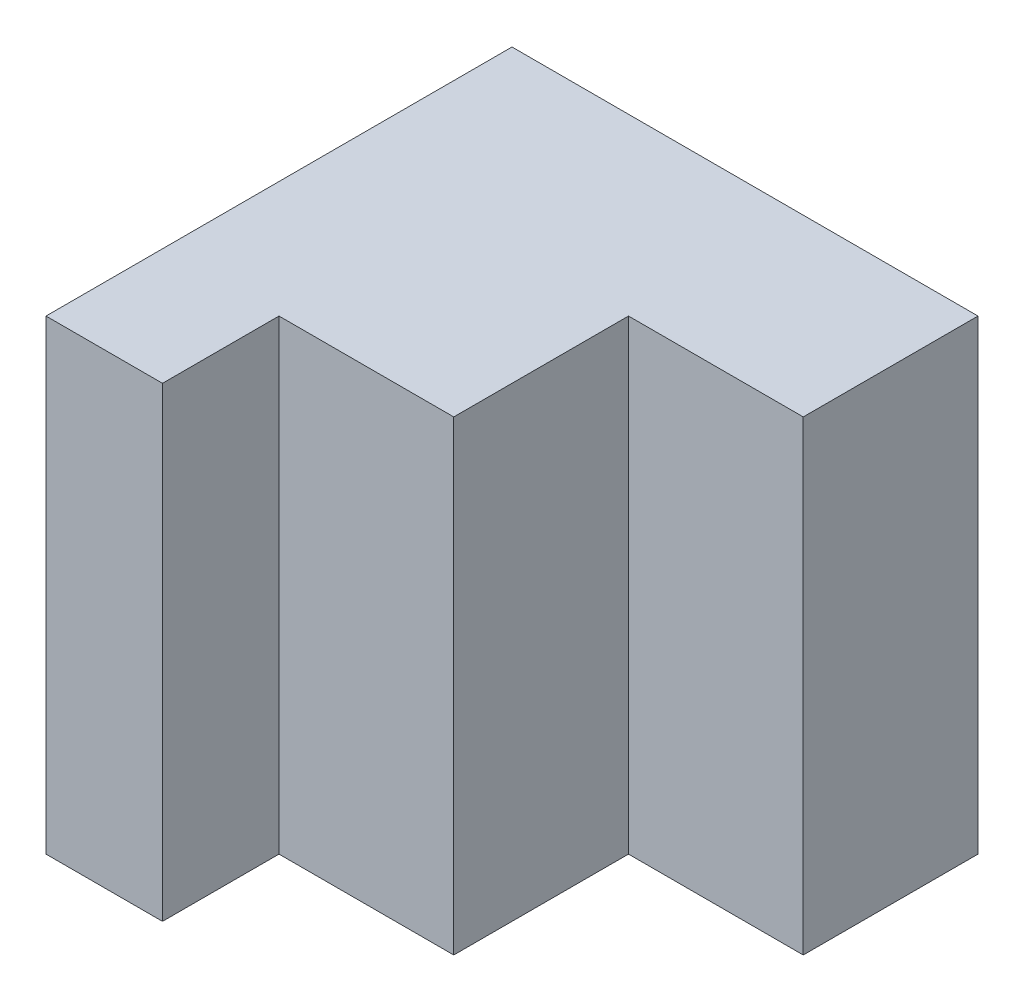
ISO-10303-21;
HEADER;
FILE_DESCRIPTION(('STEP AP214'),'2;1');
FILE_NAME('part.step','',(''),(''),'','','');
FILE_SCHEMA(('AUTOMOTIVE_DESIGN { 1 0 10303 214 1 1 1 1 }'));
ENDSEC;
DATA;
#1=APPLICATION_CONTEXT('core data for automotive mechanical design processes');
#2=APPLICATION_PROTOCOL_DEFINITION('international standard','automotive_design',2000,#1);
#3=PRODUCT_CONTEXT('',#1,'mechanical');
#4=PRODUCT('Part','Part','',(#3));
#5=PRODUCT_RELATED_PRODUCT_CATEGORY('part','',(#4));
#6=PRODUCT_DEFINITION_FORMATION('','',#4);
#7=PRODUCT_DEFINITION_CONTEXT('part definition',#1,'design');
#8=PRODUCT_DEFINITION('design','',#6,#7);
#9=PRODUCT_DEFINITION_SHAPE('','',#8);
#10=(LENGTH_UNIT() NAMED_UNIT(*) SI_UNIT(.MILLI.,.METRE.));
#11=(NAMED_UNIT(*) PLANE_ANGLE_UNIT() SI_UNIT($,.RADIAN.));
#12=(NAMED_UNIT(*) SI_UNIT($,.STERADIAN.) SOLID_ANGLE_UNIT());
#13=UNCERTAINTY_MEASURE_WITH_UNIT(LENGTH_MEASURE(1.E-05),#10,'distance_accuracy_value','');
#14=(GEOMETRIC_REPRESENTATION_CONTEXT(3) GLOBAL_UNCERTAINTY_ASSIGNED_CONTEXT((#13)) GLOBAL_UNIT_ASSIGNED_CONTEXT((#10,
#11,#12)) REPRESENTATION_CONTEXT('',''));
#15=CARTESIAN_POINT('',(0.,0.,0.));
#16=DIRECTION('',(0.,0.,1.));
#17=DIRECTION('',(1.,0.,0.));
#18=AXIS2_PLACEMENT_3D('',#15,#16,#17);
#19=CARTESIAN_POINT('',(0.,40.,40.));
#20=DIRECTION('',(0.,1.,0.));
#21=DIRECTION('',(0.,0.,1.));
#22=AXIS2_PLACEMENT_3D('',#19,#20,#21);
#23=PLANE('',#22);
#24=DIRECTION('',(1.,0.,0.));
#25=VECTOR('',#24,1.);
#26=CARTESIAN_POINT('',(0.,40.,0.));
#27=LINE('',#26,#25);
#28=CARTESIAN_POINT('',(-40.,40.,0.));
#29=VERTEX_POINT('',#28);
#30=CARTESIAN_POINT('',(0.,40.,0.));
#31=VERTEX_POINT('',#30);
#32=EDGE_CURVE('E136',#29,#31,#27,.T.);
#33=ORIENTED_EDGE('',*,*,#32,.F.);
#34=DIRECTION('',(0.,0.,-1.));
#35=VECTOR('',#34,1.);
#36=CARTESIAN_POINT('',(-40.,40.,40.));
#37=LINE('',#36,#35);
#38=CARTESIAN_POINT('',(-40.,40.,40.));
#39=VERTEX_POINT('',#38);
#40=EDGE_CURVE('E11',#39,#29,#37,.T.);
#41=ORIENTED_EDGE('',*,*,#40,.F.);
#42=DIRECTION('',(1.,0.,0.));
#43=VECTOR('',#42,1.);
#44=CARTESIAN_POINT('',(0.,40.,40.));
#45=LINE('',#44,#43);
#46=CARTESIAN_POINT('',(-30.,40.,40.));
#47=VERTEX_POINT('',#46);
#48=EDGE_CURVE('E137',#39,#47,#45,.T.);
#49=ORIENTED_EDGE('',*,*,#48,.T.);
#50=DIRECTION('',(0.,0.,-1.));
#51=VECTOR('',#50,1.);
#52=CARTESIAN_POINT('',(-30.,40.,40.));
#53=LINE('',#52,#51);
#54=CARTESIAN_POINT('',(-30.,40.,30.));
#55=VERTEX_POINT('',#54);
#56=EDGE_CURVE('E149',#47,#55,#53,.T.);
#57=ORIENTED_EDGE('',*,*,#56,.T.);
#58=DIRECTION('',(1.,0.,0.));
#59=VECTOR('',#58,1.);
#60=CARTESIAN_POINT('',(0.,40.,30.));
#61=LINE('',#60,#59);
#62=CARTESIAN_POINT('',(-15.,40.,30.));
#63=VERTEX_POINT('',#62);
#64=EDGE_CURVE('E130',#55,#63,#61,.T.);
#65=ORIENTED_EDGE('',*,*,#64,.T.);
#66=DIRECTION('',(0.,0.,-1.));
#67=VECTOR('',#66,1.);
#68=CARTESIAN_POINT('',(-15.,40.,30.));
#69=LINE('',#68,#67);
#70=CARTESIAN_POINT('',(-15.,40.,15.));
#71=VERTEX_POINT('',#70);
#72=EDGE_CURVE('E102',#63,#71,#69,.T.);
#73=ORIENTED_EDGE('',*,*,#72,.T.);
#74=DIRECTION('',(1.,0.,0.));
#75=VECTOR('',#74,1.);
#76=CARTESIAN_POINT('',(0.,40.,15.));
#77=LINE('',#76,#75);
#78=CARTESIAN_POINT('',(0.,40.,15.));
#79=VERTEX_POINT('',#78);
#80=EDGE_CURVE('E111',#71,#79,#77,.T.);
#81=ORIENTED_EDGE('',*,*,#80,.T.);
#82=DIRECTION('',(0.,0.,-1.));
#83=VECTOR('',#82,1.);
#84=CARTESIAN_POINT('',(0.,40.,15.));
#85=LINE('',#84,#83);
#86=EDGE_CURVE('E119',#79,#31,#85,.T.);
#87=ORIENTED_EDGE('',*,*,#86,.T.);
#88=EDGE_LOOP('',(#33,#41,#49,#57,#65,#73,#81,#87));
#89=FACE_BOUND('',#88,.T.);
#90=ADVANCED_FACE('F33',(#89),#23,.T.);
#91=CARTESIAN_POINT('',(-40.,0.,40.));
#92=DIRECTION('',(-1.,0.,0.));
#93=DIRECTION('',(0.,0.,1.));
#94=AXIS2_PLACEMENT_3D('',#91,#92,#93);
#95=PLANE('',#94);
#96=DIRECTION('',(0.,1.,0.));
#97=VECTOR('',#96,1.);
#98=CARTESIAN_POINT('',(-40.,0.,0.));
#99=LINE('',#98,#97);
#100=CARTESIAN_POINT('',(-40.,0.,0.));
#101=VERTEX_POINT('',#100);
#102=EDGE_CURVE('E151',#101,#29,#99,.T.);
#103=ORIENTED_EDGE('',*,*,#102,.F.);
#104=DIRECTION('',(0.,0.,-1.));
#105=VECTOR('',#104,1.);
#106=CARTESIAN_POINT('',(-40.,0.,40.));
#107=LINE('',#106,#105);
#108=CARTESIAN_POINT('',(-40.,0.,40.));
#109=VERTEX_POINT('',#108);
#110=EDGE_CURVE('E40',#109,#101,#107,.T.);
#111=ORIENTED_EDGE('',*,*,#110,.F.);
#112=DIRECTION('',(0.,1.,0.));
#113=VECTOR('',#112,1.);
#114=CARTESIAN_POINT('',(-40.,0.,40.));
#115=LINE('',#114,#113);
#116=EDGE_CURVE('E140',#109,#39,#115,.T.);
#117=ORIENTED_EDGE('',*,*,#116,.T.);
#118=ORIENTED_EDGE('',*,*,#40,.T.);
#119=EDGE_LOOP('',(#103,#111,#117,#118));
#120=FACE_BOUND('',#119,.T.);
#121=ADVANCED_FACE('F166',(#120),#95,.T.);
#122=CARTESIAN_POINT('',(0.,0.,40.));
#123=DIRECTION('',(0.,1.,0.));
#124=DIRECTION('',(0.,0.,1.));
#125=AXIS2_PLACEMENT_3D('',#122,#123,#124);
#126=PLANE('',#125);
#127=DIRECTION('',(1.,0.,0.));
#128=VECTOR('',#127,1.);
#129=CARTESIAN_POINT('',(0.,0.,0.));
#130=LINE('',#129,#128);
#131=CARTESIAN_POINT('',(0.,0.,0.));
#132=VERTEX_POINT('',#131);
#133=EDGE_CURVE('E141',#101,#132,#130,.T.);
#134=ORIENTED_EDGE('',*,*,#133,.T.);
#135=DIRECTION('',(0.,0.,-1.));
#136=VECTOR('',#135,1.);
#137=CARTESIAN_POINT('',(0.,0.,15.));
#138=LINE('',#137,#136);
#139=CARTESIAN_POINT('',(0.,0.,15.));
#140=VERTEX_POINT('',#139);
#141=EDGE_CURVE('E115',#140,#132,#138,.T.);
#142=ORIENTED_EDGE('',*,*,#141,.F.);
#143=DIRECTION('',(1.,0.,0.));
#144=VECTOR('',#143,1.);
#145=CARTESIAN_POINT('',(0.,0.,15.));
#146=LINE('',#145,#144);
#147=CARTESIAN_POINT('',(-15.,0.,15.));
#148=VERTEX_POINT('',#147);
#149=EDGE_CURVE('E108',#148,#140,#146,.T.);
#150=ORIENTED_EDGE('',*,*,#149,.F.);
#151=DIRECTION('',(0.,0.,-1.));
#152=VECTOR('',#151,1.);
#153=CARTESIAN_POINT('',(-15.,0.,30.));
#154=LINE('',#153,#152);
#155=CARTESIAN_POINT('',(-15.,0.,30.));
#156=VERTEX_POINT('',#155);
#157=EDGE_CURVE('E95',#156,#148,#154,.T.);
#158=ORIENTED_EDGE('',*,*,#157,.F.);
#159=DIRECTION('',(1.,0.,0.));
#160=VECTOR('',#159,1.);
#161=CARTESIAN_POINT('',(0.,0.,30.));
#162=LINE('',#161,#160);
#163=CARTESIAN_POINT('',(-30.,0.,30.));
#164=VERTEX_POINT('',#163);
#165=EDGE_CURVE('E103',#164,#156,#162,.T.);
#166=ORIENTED_EDGE('',*,*,#165,.F.);
#167=DIRECTION('',(0.,0.,-1.));
#168=VECTOR('',#167,1.);
#169=CARTESIAN_POINT('',(-30.,0.,40.));
#170=LINE('',#169,#168);
#171=CARTESIAN_POINT('',(-30.,0.,40.));
#172=VERTEX_POINT('',#171);
#173=EDGE_CURVE('E156',#172,#164,#170,.T.);
#174=ORIENTED_EDGE('',*,*,#173,.F.);
#175=DIRECTION('',(1.,0.,0.));
#176=VECTOR('',#175,1.);
#177=CARTESIAN_POINT('',(0.,0.,40.));
#178=LINE('',#177,#176);
#179=EDGE_CURVE('E144',#109,#172,#178,.T.);
#180=ORIENTED_EDGE('',*,*,#179,.F.);
#181=ORIENTED_EDGE('',*,*,#110,.T.);
#182=EDGE_LOOP('',(#134,#142,#150,#158,#166,#174,#180,#181));
#183=FACE_BOUND('',#182,.T.);
#184=ADVANCED_FACE('F113',(#183),#126,.F.);
#185=CARTESIAN_POINT('',(-30.,0.,40.));
#186=DIRECTION('',(1.,0.,0.));
#187=DIRECTION('',(0.,1.,0.));
#188=AXIS2_PLACEMENT_3D('',#185,#186,#187);
#189=PLANE('',#188);
#190=DIRECTION('',(0.,-1.,0.));
#191=VECTOR('',#190,1.);
#192=CARTESIAN_POINT('',(-30.,0.,30.));
#193=LINE('',#192,#191);
#194=EDGE_CURVE('E55',#55,#164,#193,.T.);
#195=ORIENTED_EDGE('',*,*,#194,.F.);
#196=ORIENTED_EDGE('',*,*,#56,.F.);
#197=DIRECTION('',(0.,-1.,0.));
#198=VECTOR('',#197,1.);
#199=CARTESIAN_POINT('',(-30.,0.,40.));
#200=LINE('',#199,#198);
#201=EDGE_CURVE('E146',#47,#172,#200,.T.);
#202=ORIENTED_EDGE('',*,*,#201,.T.);
#203=ORIENTED_EDGE('',*,*,#173,.T.);
#204=EDGE_LOOP('',(#195,#196,#202,#203));
#205=FACE_BOUND('',#204,.T.);
#206=ADVANCED_FACE('F190',(#205),#189,.T.);
#207=CARTESIAN_POINT('',(0.,0.,40.));
#208=DIRECTION('',(0.,0.,1.));
#209=DIRECTION('',(1.,0.,0.));
#210=AXIS2_PLACEMENT_3D('',#207,#208,#209);
#211=PLANE('',#210);
#212=ORIENTED_EDGE('',*,*,#48,.F.);
#213=ORIENTED_EDGE('',*,*,#116,.F.);
#214=ORIENTED_EDGE('',*,*,#179,.T.);
#215=ORIENTED_EDGE('',*,*,#201,.F.);
#216=EDGE_LOOP('',(#212,#213,#214,#215));
#217=FACE_BOUND('',#216,.T.);
#218=ADVANCED_FACE('F195',(#217),#211,.T.);
#219=CARTESIAN_POINT('',(0.,0.,0.));
#220=DIRECTION('',(0.,0.,1.));
#221=DIRECTION('',(1.,0.,0.));
#222=AXIS2_PLACEMENT_3D('',#219,#220,#221);
#223=PLANE('',#222);
#224=ORIENTED_EDGE('',*,*,#32,.T.);
#225=DIRECTION('',(0.,1.,0.));
#226=VECTOR('',#225,1.);
#227=CARTESIAN_POINT('',(0.,0.,0.));
#228=LINE('',#227,#226);
#229=EDGE_CURVE('E123',#132,#31,#228,.T.);
#230=ORIENTED_EDGE('',*,*,#229,.F.);
#231=ORIENTED_EDGE('',*,*,#133,.F.);
#232=ORIENTED_EDGE('',*,*,#102,.T.);
#233=EDGE_LOOP('',(#224,#230,#231,#232));
#234=FACE_BOUND('',#233,.T.);
#235=ADVANCED_FACE('F165',(#234),#223,.F.);
#236=CARTESIAN_POINT('',(-15.,0.,30.));
#237=DIRECTION('',(1.,0.,0.));
#238=DIRECTION('',(0.,1.,0.));
#239=AXIS2_PLACEMENT_3D('',#236,#237,#238);
#240=PLANE('',#239);
#241=DIRECTION('',(0.,-1.,0.));
#242=VECTOR('',#241,1.);
#243=CARTESIAN_POINT('',(-15.,0.,15.));
#244=LINE('',#243,#242);
#245=EDGE_CURVE('E47',#71,#148,#244,.T.);
#246=ORIENTED_EDGE('',*,*,#245,.F.);
#247=ORIENTED_EDGE('',*,*,#72,.F.);
#248=DIRECTION('',(0.,-1.,0.));
#249=VECTOR('',#248,1.);
#250=CARTESIAN_POINT('',(-15.,0.,30.));
#251=LINE('',#250,#249);
#252=EDGE_CURVE('E98',#63,#156,#251,.T.);
#253=ORIENTED_EDGE('',*,*,#252,.T.);
#254=ORIENTED_EDGE('',*,*,#157,.T.);
#255=EDGE_LOOP('',(#246,#247,#253,#254));
#256=FACE_BOUND('',#255,.T.);
#257=ADVANCED_FACE('F96',(#256),#240,.T.);
#258=CARTESIAN_POINT('',(0.,0.,30.));
#259=DIRECTION('',(0.,0.,1.));
#260=DIRECTION('',(1.,0.,0.));
#261=AXIS2_PLACEMENT_3D('',#258,#259,#260);
#262=PLANE('',#261);
#263=ORIENTED_EDGE('',*,*,#252,.F.);
#264=ORIENTED_EDGE('',*,*,#64,.F.);
#265=ORIENTED_EDGE('',*,*,#194,.T.);
#266=ORIENTED_EDGE('',*,*,#165,.T.);
#267=EDGE_LOOP('',(#263,#264,#265,#266));
#268=FACE_BOUND('',#267,.T.);
#269=ADVANCED_FACE('F174',(#268),#262,.T.);
#270=CARTESIAN_POINT('',(0.,0.,15.));
#271=DIRECTION('',(-1.,0.,0.));
#272=DIRECTION('',(0.,0.,1.));
#273=AXIS2_PLACEMENT_3D('',#270,#271,#272);
#274=PLANE('',#273);
#275=ORIENTED_EDGE('',*,*,#229,.T.);
#276=ORIENTED_EDGE('',*,*,#86,.F.);
#277=DIRECTION('',(0.,1.,0.));
#278=VECTOR('',#277,1.);
#279=CARTESIAN_POINT('',(0.,0.,15.));
#280=LINE('',#279,#278);
#281=EDGE_CURVE('E117',#140,#79,#280,.T.);
#282=ORIENTED_EDGE('',*,*,#281,.F.);
#283=ORIENTED_EDGE('',*,*,#141,.T.);
#284=EDGE_LOOP('',(#275,#276,#282,#283));
#285=FACE_BOUND('',#284,.T.);
#286=ADVANCED_FACE('F172',(#285),#274,.F.);
#287=CARTESIAN_POINT('',(0.,0.,15.));
#288=DIRECTION('',(0.,0.,1.));
#289=DIRECTION('',(1.,0.,0.));
#290=AXIS2_PLACEMENT_3D('',#287,#288,#289);
#291=PLANE('',#290);
#292=ORIENTED_EDGE('',*,*,#80,.F.);
#293=ORIENTED_EDGE('',*,*,#245,.T.);
#294=ORIENTED_EDGE('',*,*,#149,.T.);
#295=ORIENTED_EDGE('',*,*,#281,.T.);
#296=EDGE_LOOP('',(#292,#293,#294,#295));
#297=FACE_BOUND('',#296,.T.);
#298=ADVANCED_FACE('F107',(#297),#291,.T.);
#299=CLOSED_SHELL('',(#90,#121,#184,#206,#218,#235,#257,#269,#286,#298));
#300=MANIFOLD_SOLID_BREP('B2',#299);
#301=ADVANCED_BREP_SHAPE_REPRESENTATION('',(#18,#300),#14);
#302=SHAPE_DEFINITION_REPRESENTATION(#9,#301);
ENDSEC;
END-ISO-10303-21;
